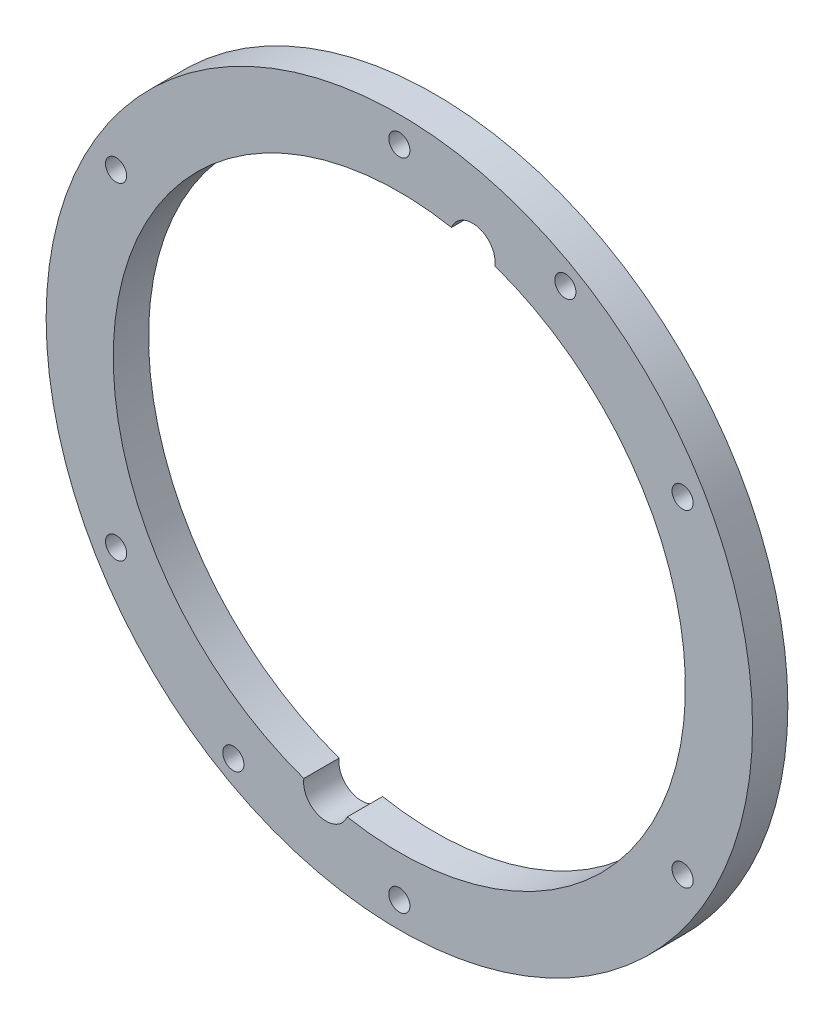
ISO-10303-21;
HEADER;
FILE_DESCRIPTION(('STEP AP214'),'2;1');
FILE_NAME('part.step','',(''),(''),'','','');
FILE_SCHEMA(('AUTOMOTIVE_DESIGN { 1 0 10303 214 1 1 1 1 }'));
ENDSEC;
DATA;
#1=APPLICATION_CONTEXT('core data for automotive mechanical design processes');
#2=APPLICATION_PROTOCOL_DEFINITION('international standard','automotive_design',2000,#1);
#3=PRODUCT_CONTEXT('',#1,'mechanical');
#4=PRODUCT('Part','Part','',(#3));
#5=PRODUCT_RELATED_PRODUCT_CATEGORY('part','',(#4));
#6=PRODUCT_DEFINITION_FORMATION('','',#4);
#7=PRODUCT_DEFINITION_CONTEXT('part definition',#1,'design');
#8=PRODUCT_DEFINITION('design','',#6,#7);
#9=PRODUCT_DEFINITION_SHAPE('','',#8);
#10=(LENGTH_UNIT() NAMED_UNIT(*) SI_UNIT(.MILLI.,.METRE.));
#11=(NAMED_UNIT(*) PLANE_ANGLE_UNIT() SI_UNIT($,.RADIAN.));
#12=(NAMED_UNIT(*) SI_UNIT($,.STERADIAN.) SOLID_ANGLE_UNIT());
#13=UNCERTAINTY_MEASURE_WITH_UNIT(LENGTH_MEASURE(1.E-05),#10,'distance_accuracy_value','');
#14=(GEOMETRIC_REPRESENTATION_CONTEXT(3) GLOBAL_UNCERTAINTY_ASSIGNED_CONTEXT((#13)) GLOBAL_UNIT_ASSIGNED_CONTEXT((#10,
#11,#12)) REPRESENTATION_CONTEXT('',''));
#15=CARTESIAN_POINT('',(0.,0.,0.));
#16=DIRECTION('',(0.,0.,1.));
#17=DIRECTION('',(1.,0.,0.));
#18=AXIS2_PLACEMENT_3D('',#15,#16,#17);
#19=CARTESIAN_POINT('',(0.,0.,-5.));
#20=DIRECTION('',(0.,0.,1.));
#21=DIRECTION('',(1.,0.,0.));
#22=AXIS2_PLACEMENT_3D('',#19,#20,#21);
#23=CYLINDRICAL_SURFACE('',#22,40.5);
#24=CARTESIAN_POINT('',(0.,0.,0.));
#25=DIRECTION('',(0.,0.,1.));
#26=DIRECTION('',(1.,0.,0.));
#27=AXIS2_PLACEMENT_3D('',#24,#25,#26);
#28=CIRCLE('',#27,40.5);
#29=CARTESIAN_POINT('',(7.38020023163642,39.8218865015327,0.));
#30=VERTEX_POINT('',#29);
#31=CARTESIAN_POINT('',(-13.5195023651534,-38.1768654527662,0.));
#32=VERTEX_POINT('',#31);
#33=EDGE_CURVE('E107',#30,#32,#28,.T.);
#34=ORIENTED_EDGE('',*,*,#33,.F.);
#35=DIRECTION('',(0.,0.,1.));
#36=VECTOR('',#35,1.);
#37=CARTESIAN_POINT('',(7.38020023163646,39.8218865015327,0.));
#38=LINE('',#37,#36);
#39=CARTESIAN_POINT('',(7.38020023163646,39.8218865015327,5.));
#40=VERTEX_POINT('',#39);
#41=EDGE_CURVE('E11',#30,#40,#38,.T.);
#42=ORIENTED_EDGE('',*,*,#41,.T.);
#43=CARTESIAN_POINT('',(0.,0.,5.));
#44=DIRECTION('',(0.,0.,1.));
#45=DIRECTION('',(1.,0.,0.));
#46=AXIS2_PLACEMENT_3D('',#43,#44,#45);
#47=CIRCLE('',#46,40.5);
#48=CARTESIAN_POINT('',(-13.5195023651534,-38.1768654527662,5.));
#49=VERTEX_POINT('',#48);
#50=EDGE_CURVE('E95',#40,#49,#47,.T.);
#51=ORIENTED_EDGE('',*,*,#50,.T.);
#52=DIRECTION('',(0.,0.,1.));
#53=VECTOR('',#52,1.);
#54=CARTESIAN_POINT('',(-13.5195023651534,-38.1768654527662,0.));
#55=LINE('',#54,#53);
#56=EDGE_CURVE('E77',#49,#32,#55,.F.);
#57=ORIENTED_EDGE('',*,*,#56,.T.);
#58=EDGE_LOOP('',(#34,#42,#51,#57));
#59=FACE_BOUND('',#58,.T.);
#60=ADVANCED_FACE('F34',(#59),#23,.F.);
#61=CARTESIAN_POINT('',(0.,0.,5.));
#62=DIRECTION('',(0.,0.,1.));
#63=DIRECTION('',(1.,0.,0.));
#64=AXIS2_PLACEMENT_3D('',#61,#62,#63);
#65=PLANE('',#64);
#66=CARTESIAN_POINT('',(10.3527618041009,38.6370330515627,5.));
#67=DIRECTION('',(0.,0.,1.));
#68=DIRECTION('',(1.,0.,0.));
#69=AXIS2_PLACEMENT_3D('',#66,#67,#68);
#70=CIRCLE('',#69,3.19999999999965);
#71=CARTESIAN_POINT('',(13.5195023651534,38.1768654527662,5.));
#72=VERTEX_POINT('',#71);
#73=EDGE_CURVE('E82',#72,#40,#70,.T.);
#74=ORIENTED_EDGE('',*,*,#73,.F.);
#75=CARTESIAN_POINT('',(-7.38020023163645,-39.8218865015327,5.));
#76=VERTEX_POINT('',#75);
#77=EDGE_CURVE('E88',#76,#72,#47,.T.);
#78=ORIENTED_EDGE('',*,*,#77,.F.);
#79=CARTESIAN_POINT('',(-10.3527618041008,-38.6370330515627,5.));
#80=DIRECTION('',(0.,0.,1.));
#81=DIRECTION('',(-1.,0.,0.));
#82=AXIS2_PLACEMENT_3D('',#79,#80,#81);
#83=CIRCLE('',#82,3.19999999999965);
#84=EDGE_CURVE('E73',#49,#76,#83,.T.);
#85=ORIENTED_EDGE('',*,*,#84,.F.);
#86=ORIENTED_EDGE('',*,*,#50,.F.);
#87=EDGE_LOOP('',(#74,#78,#85,#86));
#88=FACE_BOUND('',#87,.T.);
#89=CARTESIAN_POINT('',(23.5000000000001,40.7031939778686,5.));
#90=DIRECTION('',(0.,0.,1.));
#91=DIRECTION('',(1.,0.,0.));
#92=AXIS2_PLACEMENT_3D('',#89,#90,#91);
#93=CIRCLE('',#92,1.5);
#94=CARTESIAN_POINT('',(25.0000000000001,40.7031939778686,5.));
#95=VERTEX_POINT('',#94);
#96=EDGE_CURVE('E100',#95,#95,#93,.T.);
#97=ORIENTED_EDGE('',*,*,#96,.F.);
#98=EDGE_LOOP('',(#97));
#99=FACE_BOUND('',#98,.T.);
#100=CARTESIAN_POINT('',(-23.5000000000001,-40.7031939778686,5.));
#101=DIRECTION('',(0.,0.,1.));
#102=DIRECTION('',(1.,0.,0.));
#103=AXIS2_PLACEMENT_3D('',#100,#101,#102);
#104=CIRCLE('',#103,1.5);
#105=CARTESIAN_POINT('',(-22.0000000000001,-40.7031939778686,5.));
#106=VERTEX_POINT('',#105);
#107=EDGE_CURVE('E104',#106,#106,#104,.T.);
#108=ORIENTED_EDGE('',*,*,#107,.F.);
#109=EDGE_LOOP('',(#108));
#110=FACE_BOUND('',#109,.T.);
#111=CARTESIAN_POINT('',(40.0969761952193,-23.1500000000002,5.));
#112=DIRECTION('',(0.,0.,1.));
#113=DIRECTION('',(1.,0.,0.));
#114=AXIS2_PLACEMENT_3D('',#111,#112,#113);
#115=CIRCLE('',#114,1.5);
#116=CARTESIAN_POINT('',(41.5969761952193,-23.1500000000002,5.));
#117=VERTEX_POINT('',#116);
#118=EDGE_CURVE('E116',#117,#117,#115,.T.);
#119=ORIENTED_EDGE('',*,*,#118,.F.);
#120=EDGE_LOOP('',(#119));
#121=FACE_BOUND('',#120,.T.);
#122=CARTESIAN_POINT('',(0.,46.3,5.));
#123=DIRECTION('',(0.,0.,1.));
#124=DIRECTION('',(1.,0.,0.));
#125=AXIS2_PLACEMENT_3D('',#122,#123,#124);
#126=CIRCLE('',#125,1.5);
#127=CARTESIAN_POINT('',(1.50000000000006,46.3,5.));
#128=VERTEX_POINT('',#127);
#129=EDGE_CURVE('E128',#128,#128,#126,.T.);
#130=ORIENTED_EDGE('',*,*,#129,.F.);
#131=EDGE_LOOP('',(#130));
#132=FACE_BOUND('',#131,.T.);
#133=CARTESIAN_POINT('',(-40.0969761952194,-23.1500000000001,5.));
#134=DIRECTION('',(0.,0.,1.));
#135=DIRECTION('',(1.,0.,0.));
#136=AXIS2_PLACEMENT_3D('',#133,#134,#135);
#137=CIRCLE('',#136,1.5);
#138=CARTESIAN_POINT('',(-38.5969761952194,-23.1500000000001,5.));
#139=VERTEX_POINT('',#138);
#140=EDGE_CURVE('E140',#139,#139,#137,.T.);
#141=ORIENTED_EDGE('',*,*,#140,.F.);
#142=EDGE_LOOP('',(#141));
#143=FACE_BOUND('',#142,.T.);
#144=CARTESIAN_POINT('',(0.,0.,5.));
#145=DIRECTION('',(0.,0.,1.));
#146=DIRECTION('',(1.,0.,0.));
#147=AXIS2_PLACEMENT_3D('',#144,#145,#146);
#148=CIRCLE('',#147,50.);
#149=CARTESIAN_POINT('',(50.,0.,5.));
#150=VERTEX_POINT('',#149);
#151=EDGE_CURVE('E146',#150,#150,#148,.T.);
#152=ORIENTED_EDGE('',*,*,#151,.T.);
#153=EDGE_LOOP('',(#152));
#154=FACE_BOUND('',#153,.T.);
#155=CARTESIAN_POINT('',(-40.0969761952195,23.1499999999999,5.));
#156=DIRECTION('',(0.,0.,1.));
#157=DIRECTION('',(1.,0.,0.));
#158=AXIS2_PLACEMENT_3D('',#155,#156,#157);
#159=CIRCLE('',#158,1.5);
#160=CARTESIAN_POINT('',(-38.5969761952195,23.1499999999999,5.));
#161=VERTEX_POINT('',#160);
#162=EDGE_CURVE('E134',#161,#161,#159,.T.);
#163=ORIENTED_EDGE('',*,*,#162,.F.);
#164=EDGE_LOOP('',(#163));
#165=FACE_BOUND('',#164,.T.);
#166=CARTESIAN_POINT('',(40.0969761952195,23.1499999999998,5.));
#167=DIRECTION('',(0.,0.,1.));
#168=DIRECTION('',(1.,0.,0.));
#169=AXIS2_PLACEMENT_3D('',#166,#167,#168);
#170=CIRCLE('',#169,1.5);
#171=CARTESIAN_POINT('',(41.5969761952195,23.1499999999998,5.));
#172=VERTEX_POINT('',#171);
#173=EDGE_CURVE('E122',#172,#172,#170,.T.);
#174=ORIENTED_EDGE('',*,*,#173,.F.);
#175=EDGE_LOOP('',(#174));
#176=FACE_BOUND('',#175,.T.);
#177=CARTESIAN_POINT('',(-3.7470027081099E-13,-46.3,5.));
#178=DIRECTION('',(0.,0.,1.));
#179=DIRECTION('',(1.,0.,0.));
#180=AXIS2_PLACEMENT_3D('',#177,#178,#179);
#181=CIRCLE('',#180,1.5);
#182=CARTESIAN_POINT('',(1.49999999999963,-46.3,5.));
#183=VERTEX_POINT('',#182);
#184=EDGE_CURVE('E108',#183,#183,#181,.T.);
#185=ORIENTED_EDGE('',*,*,#184,.F.);
#186=EDGE_LOOP('',(#185));
#187=FACE_BOUND('',#186,.T.);
#188=ADVANCED_FACE('F93',(#88,#99,#110,#121,#132,#143,#154,#165,#176,#187),#65,.T.);
#189=CARTESIAN_POINT('',(0.,0.,0.));
#190=DIRECTION('',(0.,0.,1.));
#191=DIRECTION('',(1.,0.,0.));
#192=AXIS2_PLACEMENT_3D('',#189,#190,#191);
#193=PLANE('',#192);
#194=CARTESIAN_POINT('',(-7.38020023163641,-39.8218865015327,0.));
#195=VERTEX_POINT('',#194);
#196=CARTESIAN_POINT('',(13.5195023651534,38.1768654527662,0.));
#197=VERTEX_POINT('',#196);
#198=EDGE_CURVE('E90',#195,#197,#28,.T.);
#199=ORIENTED_EDGE('',*,*,#198,.T.);
#200=CARTESIAN_POINT('',(10.3527618041009,38.6370330515627,0.));
#201=DIRECTION('',(0.,0.,1.));
#202=DIRECTION('',(1.,0.,0.));
#203=AXIS2_PLACEMENT_3D('',#200,#201,#202);
#204=CIRCLE('',#203,3.19999999999965);
#205=EDGE_CURVE('E57',#197,#30,#204,.T.);
#206=ORIENTED_EDGE('',*,*,#205,.T.);
#207=ORIENTED_EDGE('',*,*,#33,.T.);
#208=CARTESIAN_POINT('',(-10.3527618041008,-38.6370330515627,0.));
#209=DIRECTION('',(0.,0.,1.));
#210=DIRECTION('',(1.,0.,0.));
#211=AXIS2_PLACEMENT_3D('',#208,#209,#210);
#212=CIRCLE('',#211,3.19999999999965);
#213=EDGE_CURVE('E49',#32,#195,#212,.T.);
#214=ORIENTED_EDGE('',*,*,#213,.T.);
#215=EDGE_LOOP('',(#199,#206,#207,#214));
#216=FACE_BOUND('',#215,.T.);
#217=CARTESIAN_POINT('',(23.5000000000001,40.7031939778686,0.));
#218=DIRECTION('',(0.,0.,1.));
#219=DIRECTION('',(1.,0.,0.));
#220=AXIS2_PLACEMENT_3D('',#217,#218,#219);
#221=CIRCLE('',#220,1.5);
#222=CARTESIAN_POINT('',(25.0000000000001,40.7031939778686,0.));
#223=VERTEX_POINT('',#222);
#224=EDGE_CURVE('E115',#223,#223,#221,.T.);
#225=ORIENTED_EDGE('',*,*,#224,.T.);
#226=EDGE_LOOP('',(#225));
#227=FACE_BOUND('',#226,.T.);
#228=CARTESIAN_POINT('',(-23.5000000000001,-40.7031939778686,0.));
#229=DIRECTION('',(0.,0.,1.));
#230=DIRECTION('',(1.,0.,0.));
#231=AXIS2_PLACEMENT_3D('',#228,#229,#230);
#232=CIRCLE('',#231,1.5);
#233=CARTESIAN_POINT('',(-22.0000000000001,-40.7031939778686,0.));
#234=VERTEX_POINT('',#233);
#235=EDGE_CURVE('E103',#234,#234,#232,.T.);
#236=ORIENTED_EDGE('',*,*,#235,.T.);
#237=EDGE_LOOP('',(#236));
#238=FACE_BOUND('',#237,.T.);
#239=CARTESIAN_POINT('',(0.,0.,0.));
#240=DIRECTION('',(0.,0.,1.));
#241=DIRECTION('',(1.,0.,0.));
#242=AXIS2_PLACEMENT_3D('',#239,#240,#241);
#243=CIRCLE('',#242,50.);
#244=CARTESIAN_POINT('',(50.,0.,0.));
#245=VERTEX_POINT('',#244);
#246=EDGE_CURVE('E143',#245,#245,#243,.T.);
#247=ORIENTED_EDGE('',*,*,#246,.F.);
#248=EDGE_LOOP('',(#247));
#249=FACE_BOUND('',#248,.T.);
#250=CARTESIAN_POINT('',(-40.0969761952194,-23.1500000000001,0.));
#251=DIRECTION('',(0.,0.,1.));
#252=DIRECTION('',(1.,0.,0.));
#253=AXIS2_PLACEMENT_3D('',#250,#251,#252);
#254=CIRCLE('',#253,1.5);
#255=CARTESIAN_POINT('',(-38.5969761952194,-23.1500000000001,0.));
#256=VERTEX_POINT('',#255);
#257=EDGE_CURVE('E137',#256,#256,#254,.T.);
#258=ORIENTED_EDGE('',*,*,#257,.T.);
#259=EDGE_LOOP('',(#258));
#260=FACE_BOUND('',#259,.T.);
#261=CARTESIAN_POINT('',(-40.0969761952195,23.1499999999999,0.));
#262=DIRECTION('',(0.,0.,1.));
#263=DIRECTION('',(1.,0.,0.));
#264=AXIS2_PLACEMENT_3D('',#261,#262,#263);
#265=CIRCLE('',#264,1.5);
#266=CARTESIAN_POINT('',(-38.5969761952195,23.1499999999999,0.));
#267=VERTEX_POINT('',#266);
#268=EDGE_CURVE('E131',#267,#267,#265,.T.);
#269=ORIENTED_EDGE('',*,*,#268,.T.);
#270=EDGE_LOOP('',(#269));
#271=FACE_BOUND('',#270,.T.);
#272=CARTESIAN_POINT('',(0.,46.3,0.));
#273=DIRECTION('',(0.,0.,1.));
#274=DIRECTION('',(1.,0.,0.));
#275=AXIS2_PLACEMENT_3D('',#272,#273,#274);
#276=CIRCLE('',#275,1.5);
#277=CARTESIAN_POINT('',(1.50000000000006,46.3,0.));
#278=VERTEX_POINT('',#277);
#279=EDGE_CURVE('E125',#278,#278,#276,.T.);
#280=ORIENTED_EDGE('',*,*,#279,.T.);
#281=EDGE_LOOP('',(#280));
#282=FACE_BOUND('',#281,.T.);
#283=CARTESIAN_POINT('',(40.0969761952195,23.1499999999998,0.));
#284=DIRECTION('',(0.,0.,1.));
#285=DIRECTION('',(1.,0.,0.));
#286=AXIS2_PLACEMENT_3D('',#283,#284,#285);
#287=CIRCLE('',#286,1.5);
#288=CARTESIAN_POINT('',(41.5969761952195,23.1499999999998,0.));
#289=VERTEX_POINT('',#288);
#290=EDGE_CURVE('E119',#289,#289,#287,.T.);
#291=ORIENTED_EDGE('',*,*,#290,.T.);
#292=EDGE_LOOP('',(#291));
#293=FACE_BOUND('',#292,.T.);
#294=CARTESIAN_POINT('',(40.0969761952193,-23.1500000000002,0.));
#295=DIRECTION('',(0.,0.,1.));
#296=DIRECTION('',(1.,0.,0.));
#297=AXIS2_PLACEMENT_3D('',#294,#295,#296);
#298=CIRCLE('',#297,1.5);
#299=CARTESIAN_POINT('',(41.5969761952193,-23.1500000000002,0.));
#300=VERTEX_POINT('',#299);
#301=EDGE_CURVE('E111',#300,#300,#298,.T.);
#302=ORIENTED_EDGE('',*,*,#301,.T.);
#303=EDGE_LOOP('',(#302));
#304=FACE_BOUND('',#303,.T.);
#305=CARTESIAN_POINT('',(-3.7470027081099E-13,-46.3,0.));
#306=DIRECTION('',(0.,0.,1.));
#307=DIRECTION('',(1.,0.,0.));
#308=AXIS2_PLACEMENT_3D('',#305,#306,#307);
#309=CIRCLE('',#308,1.5);
#310=CARTESIAN_POINT('',(1.49999999999963,-46.3,0.));
#311=VERTEX_POINT('',#310);
#312=EDGE_CURVE('E112',#311,#311,#309,.T.);
#313=ORIENTED_EDGE('',*,*,#312,.T.);
#314=EDGE_LOOP('',(#313));
#315=FACE_BOUND('',#314,.T.);
#316=ADVANCED_FACE('F157',(#216,#227,#238,#249,#260,#271,#282,#293,#304,#315),#193,.F.);
#317=CARTESIAN_POINT('',(0.,0.,5.));
#318=DIRECTION('',(0.,0.,-1.));
#319=DIRECTION('',(-1.,0.,0.));
#320=AXIS2_PLACEMENT_3D('',#317,#318,#319);
#321=CYLINDRICAL_SURFACE('',#320,50.);
#322=ORIENTED_EDGE('',*,*,#151,.F.);
#323=EDGE_LOOP('',(#322));
#324=FACE_BOUND('',#323,.T.);
#325=ORIENTED_EDGE('',*,*,#246,.T.);
#326=EDGE_LOOP('',(#325));
#327=FACE_BOUND('',#326,.T.);
#328=ADVANCED_FACE('F36',(#324,#327),#321,.T.);
#329=CARTESIAN_POINT('',(-40.0969761952194,-23.1500000000001,5.));
#330=DIRECTION('',(0.,0.,-1.));
#331=DIRECTION('',(-1.,0.,0.));
#332=AXIS2_PLACEMENT_3D('',#329,#330,#331);
#333=CYLINDRICAL_SURFACE('',#332,1.5);
#334=ORIENTED_EDGE('',*,*,#140,.T.);
#335=EDGE_LOOP('',(#334));
#336=FACE_BOUND('',#335,.T.);
#337=ORIENTED_EDGE('',*,*,#257,.F.);
#338=EDGE_LOOP('',(#337));
#339=FACE_BOUND('',#338,.T.);
#340=ADVANCED_FACE('F206',(#336,#339),#333,.F.);
#341=CARTESIAN_POINT('',(-40.0969761952195,23.1499999999999,5.));
#342=DIRECTION('',(0.,0.,-1.));
#343=DIRECTION('',(-1.,0.,0.));
#344=AXIS2_PLACEMENT_3D('',#341,#342,#343);
#345=CYLINDRICAL_SURFACE('',#344,1.5);
#346=ORIENTED_EDGE('',*,*,#162,.T.);
#347=EDGE_LOOP('',(#346));
#348=FACE_BOUND('',#347,.T.);
#349=ORIENTED_EDGE('',*,*,#268,.F.);
#350=EDGE_LOOP('',(#349));
#351=FACE_BOUND('',#350,.T.);
#352=ADVANCED_FACE('F202',(#348,#351),#345,.F.);
#353=CARTESIAN_POINT('',(0.,46.3,5.));
#354=DIRECTION('',(0.,0.,-1.));
#355=DIRECTION('',(-1.,0.,0.));
#356=AXIS2_PLACEMENT_3D('',#353,#354,#355);
#357=CYLINDRICAL_SURFACE('',#356,1.5);
#358=ORIENTED_EDGE('',*,*,#129,.T.);
#359=EDGE_LOOP('',(#358));
#360=FACE_BOUND('',#359,.T.);
#361=ORIENTED_EDGE('',*,*,#279,.F.);
#362=EDGE_LOOP('',(#361));
#363=FACE_BOUND('',#362,.T.);
#364=ADVANCED_FACE('F198',(#360,#363),#357,.F.);
#365=CARTESIAN_POINT('',(40.0969761952195,23.1499999999998,5.));
#366=DIRECTION('',(0.,0.,-1.));
#367=DIRECTION('',(-1.,0.,0.));
#368=AXIS2_PLACEMENT_3D('',#365,#366,#367);
#369=CYLINDRICAL_SURFACE('',#368,1.5);
#370=ORIENTED_EDGE('',*,*,#173,.T.);
#371=EDGE_LOOP('',(#370));
#372=FACE_BOUND('',#371,.T.);
#373=ORIENTED_EDGE('',*,*,#290,.F.);
#374=EDGE_LOOP('',(#373));
#375=FACE_BOUND('',#374,.T.);
#376=ADVANCED_FACE('F194',(#372,#375),#369,.F.);
#377=CARTESIAN_POINT('',(40.0969761952193,-23.1500000000002,5.));
#378=DIRECTION('',(0.,0.,-1.));
#379=DIRECTION('',(-1.,0.,0.));
#380=AXIS2_PLACEMENT_3D('',#377,#378,#379);
#381=CYLINDRICAL_SURFACE('',#380,1.5);
#382=ORIENTED_EDGE('',*,*,#118,.T.);
#383=EDGE_LOOP('',(#382));
#384=FACE_BOUND('',#383,.T.);
#385=ORIENTED_EDGE('',*,*,#301,.F.);
#386=EDGE_LOOP('',(#385));
#387=FACE_BOUND('',#386,.T.);
#388=ADVANCED_FACE('F190',(#384,#387),#381,.F.);
#389=CARTESIAN_POINT('',(-3.7470027081099E-13,-46.3,5.));
#390=DIRECTION('',(0.,0.,-1.));
#391=DIRECTION('',(-1.,0.,0.));
#392=AXIS2_PLACEMENT_3D('',#389,#390,#391);
#393=CYLINDRICAL_SURFACE('',#392,1.5);
#394=ORIENTED_EDGE('',*,*,#184,.T.);
#395=EDGE_LOOP('',(#394));
#396=FACE_BOUND('',#395,.T.);
#397=ORIENTED_EDGE('',*,*,#312,.F.);
#398=EDGE_LOOP('',(#397));
#399=FACE_BOUND('',#398,.T.);
#400=ADVANCED_FACE('F183',(#396,#399),#393,.F.);
#401=CARTESIAN_POINT('',(-23.5000000000001,-40.7031939778686,-5.));
#402=DIRECTION('',(0.,0.,1.));
#403=DIRECTION('',(1.,0.,0.));
#404=AXIS2_PLACEMENT_3D('',#401,#402,#403);
#405=CYLINDRICAL_SURFACE('',#404,1.5);
#406=ORIENTED_EDGE('',*,*,#107,.T.);
#407=EDGE_LOOP('',(#406));
#408=FACE_BOUND('',#407,.T.);
#409=ORIENTED_EDGE('',*,*,#235,.F.);
#410=EDGE_LOOP('',(#409));
#411=FACE_BOUND('',#410,.T.);
#412=ADVANCED_FACE('F178',(#408,#411),#405,.F.);
#413=CARTESIAN_POINT('',(23.5000000000001,40.7031939778686,-5.));
#414=DIRECTION('',(0.,0.,1.));
#415=DIRECTION('',(1.,0.,0.));
#416=AXIS2_PLACEMENT_3D('',#413,#414,#415);
#417=CYLINDRICAL_SURFACE('',#416,1.5);
#418=ORIENTED_EDGE('',*,*,#96,.T.);
#419=EDGE_LOOP('',(#418));
#420=FACE_BOUND('',#419,.T.);
#421=ORIENTED_EDGE('',*,*,#224,.F.);
#422=EDGE_LOOP('',(#421));
#423=FACE_BOUND('',#422,.T.);
#424=ADVANCED_FACE('F173',(#420,#423),#417,.F.);
#425=ORIENTED_EDGE('',*,*,#77,.T.);
#426=DIRECTION('',(0.,0.,1.));
#427=VECTOR('',#426,1.);
#428=CARTESIAN_POINT('',(13.5195023651534,38.1768654527662,0.));
#429=LINE('',#428,#427);
#430=EDGE_CURVE('E42',#72,#197,#429,.F.);
#431=ORIENTED_EDGE('',*,*,#430,.T.);
#432=ORIENTED_EDGE('',*,*,#198,.F.);
#433=DIRECTION('',(0.,0.,1.));
#434=VECTOR('',#433,1.);
#435=CARTESIAN_POINT('',(-7.38020023163645,-39.8218865015327,0.));
#436=LINE('',#435,#434);
#437=EDGE_CURVE('E76',#195,#76,#436,.T.);
#438=ORIENTED_EDGE('',*,*,#437,.T.);
#439=EDGE_LOOP('',(#425,#431,#432,#438));
#440=FACE_BOUND('',#439,.T.);
#441=ADVANCED_FACE('F87',(#440),#23,.F.);
#442=CARTESIAN_POINT('',(-10.3527618041008,-38.6370330515627,-5.));
#443=DIRECTION('',(0.,0.,1.));
#444=DIRECTION('',(1.,0.,0.));
#445=AXIS2_PLACEMENT_3D('',#442,#443,#444);
#446=CYLINDRICAL_SURFACE('',#445,3.19999999999965);
#447=ORIENTED_EDGE('',*,*,#213,.F.);
#448=ORIENTED_EDGE('',*,*,#56,.F.);
#449=ORIENTED_EDGE('',*,*,#84,.T.);
#450=ORIENTED_EDGE('',*,*,#437,.F.);
#451=EDGE_LOOP('',(#447,#448,#449,#450));
#452=FACE_BOUND('',#451,.T.);
#453=ADVANCED_FACE('F75',(#452),#446,.F.);
#454=CARTESIAN_POINT('',(10.3527618041009,38.6370330515627,-5.));
#455=DIRECTION('',(0.,0.,1.));
#456=DIRECTION('',(1.,0.,0.));
#457=AXIS2_PLACEMENT_3D('',#454,#455,#456);
#458=CYLINDRICAL_SURFACE('',#457,3.19999999999965);
#459=ORIENTED_EDGE('',*,*,#205,.F.);
#460=ORIENTED_EDGE('',*,*,#430,.F.);
#461=ORIENTED_EDGE('',*,*,#73,.T.);
#462=ORIENTED_EDGE('',*,*,#41,.F.);
#463=EDGE_LOOP('',(#459,#460,#461,#462));
#464=FACE_BOUND('',#463,.T.);
#465=ADVANCED_FACE('F162',(#464),#458,.F.);
#466=CLOSED_SHELL('',(#60,#188,#316,#328,#340,#352,#364,#376,#388,#400,#412,#424,#441,#453,#465));
#467=MANIFOLD_SOLID_BREP('B2',#466);
#468=ADVANCED_BREP_SHAPE_REPRESENTATION('',(#18,#467),#14);
#469=SHAPE_DEFINITION_REPRESENTATION(#9,#468);
ENDSEC;
END-ISO-10303-21;
